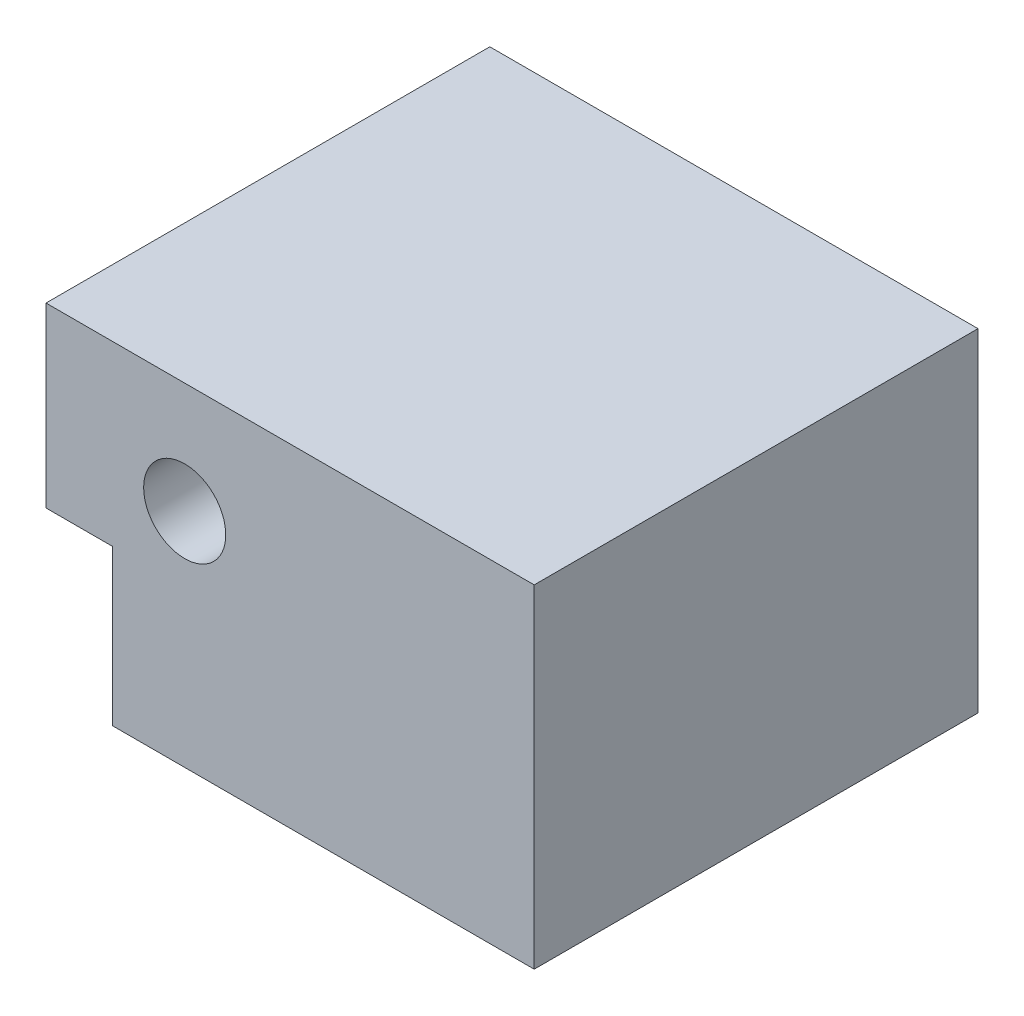
ISO-10303-21;
HEADER;
FILE_DESCRIPTION(('STEP AP214'),'2;1');
FILE_NAME('part.step','',(''),(''),'','','');
FILE_SCHEMA(('AUTOMOTIVE_DESIGN { 1 0 10303 214 1 1 1 1 }'));
ENDSEC;
DATA;
#1=APPLICATION_CONTEXT('core data for automotive mechanical design processes');
#2=APPLICATION_PROTOCOL_DEFINITION('international standard','automotive_design',2000,#1);
#3=PRODUCT_CONTEXT('',#1,'mechanical');
#4=PRODUCT('Part','Part','',(#3));
#5=PRODUCT_RELATED_PRODUCT_CATEGORY('part','',(#4));
#6=PRODUCT_DEFINITION_FORMATION('','',#4);
#7=PRODUCT_DEFINITION_CONTEXT('part definition',#1,'design');
#8=PRODUCT_DEFINITION('design','',#6,#7);
#9=PRODUCT_DEFINITION_SHAPE('','',#8);
#10=(LENGTH_UNIT() NAMED_UNIT(*) SI_UNIT(.MILLI.,.METRE.));
#11=(NAMED_UNIT(*) PLANE_ANGLE_UNIT() SI_UNIT($,.RADIAN.));
#12=(NAMED_UNIT(*) SI_UNIT($,.STERADIAN.) SOLID_ANGLE_UNIT());
#13=UNCERTAINTY_MEASURE_WITH_UNIT(LENGTH_MEASURE(1.E-05),#10,'distance_accuracy_value','');
#14=(GEOMETRIC_REPRESENTATION_CONTEXT(3) GLOBAL_UNCERTAINTY_ASSIGNED_CONTEXT((#13)) GLOBAL_UNIT_ASSIGNED_CONTEXT((#10,
#11,#12)) REPRESENTATION_CONTEXT('',''));
#15=CARTESIAN_POINT('',(0.,0.,0.));
#16=DIRECTION('',(0.,0.,1.));
#17=DIRECTION('',(1.,0.,0.));
#18=AXIS2_PLACEMENT_3D('',#15,#16,#17);
#19=CARTESIAN_POINT('',(-9.5,7.5,10.));
#20=DIRECTION('',(1.,0.,0.));
#21=DIRECTION('',(0.,0.,-1.));
#22=AXIS2_PLACEMENT_3D('',#19,#20,#21);
#23=PLANE('',#22);
#24=CARTESIAN_POINT('',(-9.5,-3.5,5.));
#25=DIRECTION('',(-1.,0.,0.));
#26=DIRECTION('',(0.,0.,1.));
#27=AXIS2_PLACEMENT_3D('',#24,#25,#26);
#28=CIRCLE('',#27,1.85);
#29=CARTESIAN_POINT('',(-9.5,-3.5,6.85));
#30=VERTEX_POINT('',#29);
#31=EDGE_CURVE('E104',#30,#30,#28,.T.);
#32=ORIENTED_EDGE('',*,*,#31,.F.);
#33=EDGE_LOOP('',(#32));
#34=FACE_BOUND('',#33,.T.);
#35=CARTESIAN_POINT('',(-9.5,-3.5,-5.));
#36=DIRECTION('',(-1.,0.,0.));
#37=DIRECTION('',(0.,0.,1.));
#38=AXIS2_PLACEMENT_3D('',#35,#36,#37);
#39=CIRCLE('',#38,1.85);
#40=CARTESIAN_POINT('',(-9.5,-3.5,-3.15));
#41=VERTEX_POINT('',#40);
#42=EDGE_CURVE('E146',#41,#41,#39,.T.);
#43=ORIENTED_EDGE('',*,*,#42,.F.);
#44=EDGE_LOOP('',(#43));
#45=FACE_BOUND('',#44,.T.);
#46=DIRECTION('',(0.,0.,1.));
#47=VECTOR('',#46,1.);
#48=CARTESIAN_POINT('',(-9.5,-0.5,-10.));
#49=LINE('',#48,#47);
#50=CARTESIAN_POINT('',(-9.5,-0.5,-10.));
#51=VERTEX_POINT('',#50);
#52=CARTESIAN_POINT('',(-9.5,-0.5,10.));
#53=VERTEX_POINT('',#52);
#54=EDGE_CURVE('E53',#51,#53,#49,.T.);
#55=ORIENTED_EDGE('',*,*,#54,.F.);
#56=DIRECTION('',(0.,-1.,0.));
#57=VECTOR('',#56,1.);
#58=CARTESIAN_POINT('',(-9.5,7.5,-10.));
#59=LINE('',#58,#57);
#60=CARTESIAN_POINT('',(-9.5,-7.5,-10.));
#61=VERTEX_POINT('',#60);
#62=EDGE_CURVE('E77',#51,#61,#59,.T.);
#63=ORIENTED_EDGE('',*,*,#62,.T.);
#64=DIRECTION('',(0.,0.,1.));
#65=VECTOR('',#64,1.);
#66=CARTESIAN_POINT('',(-9.5,-7.5,10.));
#67=LINE('',#66,#65);
#68=CARTESIAN_POINT('',(-9.5,-7.5,10.));
#69=VERTEX_POINT('',#68);
#70=EDGE_CURVE('E80',#61,#69,#67,.T.);
#71=ORIENTED_EDGE('',*,*,#70,.T.);
#72=DIRECTION('',(0.,-1.,0.));
#73=VECTOR('',#72,1.);
#74=CARTESIAN_POINT('',(-9.5,7.5,10.));
#75=LINE('',#74,#73);
#76=EDGE_CURVE('E11',#53,#69,#75,.T.);
#77=ORIENTED_EDGE('',*,*,#76,.F.);
#78=EDGE_LOOP('',(#55,#63,#71,#77));
#79=FACE_BOUND('',#78,.T.);
#80=ADVANCED_FACE('F39',(#34,#45,#79),#23,.F.);
#81=CARTESIAN_POINT('',(-9.5,7.5,10.));
#82=DIRECTION('',(0.,0.,-1.));
#83=DIRECTION('',(-1.,0.,0.));
#84=AXIS2_PLACEMENT_3D('',#81,#82,#83);
#85=PLANE('',#84);
#86=CARTESIAN_POINT('',(-6.25,2.5,10.));
#87=DIRECTION('',(0.,0.,-1.));
#88=DIRECTION('',(-1.,0.,0.));
#89=AXIS2_PLACEMENT_3D('',#86,#87,#88);
#90=CIRCLE('',#89,1.84999999999999);
#91=CARTESIAN_POINT('',(-8.1,2.5,10.));
#92=VERTEX_POINT('',#91);
#93=EDGE_CURVE('E132',#92,#92,#90,.T.);
#94=ORIENTED_EDGE('',*,*,#93,.T.);
#95=EDGE_LOOP('',(#94));
#96=FACE_BOUND('',#95,.T.);
#97=DIRECTION('',(1.,0.,0.));
#98=VECTOR('',#97,1.);
#99=CARTESIAN_POINT('',(-9.5,-7.5,10.));
#100=LINE('',#99,#98);
#101=CARTESIAN_POINT('',(9.5,-7.5,10.));
#102=VERTEX_POINT('',#101);
#103=EDGE_CURVE('E99',#69,#102,#100,.T.);
#104=ORIENTED_EDGE('',*,*,#103,.T.);
#105=DIRECTION('',(0.,-1.,0.));
#106=VECTOR('',#105,1.);
#107=CARTESIAN_POINT('',(9.5,7.5,10.));
#108=LINE('',#107,#106);
#109=CARTESIAN_POINT('',(9.5,7.5,10.));
#110=VERTEX_POINT('',#109);
#111=EDGE_CURVE('E46',#110,#102,#108,.T.);
#112=ORIENTED_EDGE('',*,*,#111,.F.);
#113=DIRECTION('',(1.,0.,0.));
#114=VECTOR('',#113,1.);
#115=CARTESIAN_POINT('',(-9.5,7.5,10.));
#116=LINE('',#115,#114);
#117=CARTESIAN_POINT('',(-12.5,7.5,10.));
#118=VERTEX_POINT('',#117);
#119=EDGE_CURVE('E94',#118,#110,#116,.T.);
#120=ORIENTED_EDGE('',*,*,#119,.F.);
#121=DIRECTION('',(0.,1.,0.));
#122=VECTOR('',#121,1.);
#123=CARTESIAN_POINT('',(-12.5,7.5,10.));
#124=LINE('',#123,#122);
#125=CARTESIAN_POINT('',(-12.5,-0.5,10.));
#126=VERTEX_POINT('',#125);
#127=EDGE_CURVE('E164',#126,#118,#124,.T.);
#128=ORIENTED_EDGE('',*,*,#127,.F.);
#129=DIRECTION('',(1.,0.,0.));
#130=VECTOR('',#129,1.);
#131=CARTESIAN_POINT('',(-12.5,-0.5,10.));
#132=LINE('',#131,#130);
#133=EDGE_CURVE('E123',#126,#53,#132,.T.);
#134=ORIENTED_EDGE('',*,*,#133,.T.);
#135=ORIENTED_EDGE('',*,*,#76,.T.);
#136=EDGE_LOOP('',(#104,#112,#120,#128,#134,#135));
#137=FACE_BOUND('',#136,.T.);
#138=ADVANCED_FACE('F116',(#96,#137),#85,.F.);
#139=CARTESIAN_POINT('',(9.5,7.5,10.));
#140=DIRECTION('',(-1.,0.,0.));
#141=DIRECTION('',(0.,0.,1.));
#142=AXIS2_PLACEMENT_3D('',#139,#140,#141);
#143=PLANE('',#142);
#144=DIRECTION('',(0.,0.,-1.));
#145=VECTOR('',#144,1.);
#146=CARTESIAN_POINT('',(9.5,-7.5,10.));
#147=LINE('',#146,#145);
#148=CARTESIAN_POINT('',(9.5,-7.5,-10.));
#149=VERTEX_POINT('',#148);
#150=EDGE_CURVE('E95',#102,#149,#147,.T.);
#151=ORIENTED_EDGE('',*,*,#150,.T.);
#152=DIRECTION('',(0.,-1.,0.));
#153=VECTOR('',#152,1.);
#154=CARTESIAN_POINT('',(9.5,7.5,-10.));
#155=LINE('',#154,#153);
#156=CARTESIAN_POINT('',(9.5,7.5,-10.));
#157=VERTEX_POINT('',#156);
#158=EDGE_CURVE('E84',#157,#149,#155,.T.);
#159=ORIENTED_EDGE('',*,*,#158,.F.);
#160=DIRECTION('',(0.,0.,-1.));
#161=VECTOR('',#160,1.);
#162=CARTESIAN_POINT('',(9.5,7.5,10.));
#163=LINE('',#162,#161);
#164=EDGE_CURVE('E62',#110,#157,#163,.T.);
#165=ORIENTED_EDGE('',*,*,#164,.F.);
#166=ORIENTED_EDGE('',*,*,#111,.T.);
#167=EDGE_LOOP('',(#151,#159,#165,#166));
#168=FACE_BOUND('',#167,.T.);
#169=ADVANCED_FACE('F113',(#168),#143,.F.);
#170=CARTESIAN_POINT('',(-9.5,7.5,-10.));
#171=DIRECTION('',(0.,0.,1.));
#172=DIRECTION('',(1.,0.,0.));
#173=AXIS2_PLACEMENT_3D('',#170,#171,#172);
#174=PLANE('',#173);
#175=CARTESIAN_POINT('',(-6.25,2.5,-10.));
#176=DIRECTION('',(0.,0.,-1.));
#177=DIRECTION('',(-1.,0.,0.));
#178=AXIS2_PLACEMENT_3D('',#175,#176,#177);
#179=CIRCLE('',#178,1.85);
#180=CARTESIAN_POINT('',(-8.1,2.5,-10.));
#181=VERTEX_POINT('',#180);
#182=EDGE_CURVE('E138',#181,#181,#179,.T.);
#183=ORIENTED_EDGE('',*,*,#182,.F.);
#184=EDGE_LOOP('',(#183));
#185=FACE_BOUND('',#184,.T.);
#186=DIRECTION('',(-1.,0.,0.));
#187=VECTOR('',#186,1.);
#188=CARTESIAN_POINT('',(-9.5,-7.5,-10.));
#189=LINE('',#188,#187);
#190=EDGE_CURVE('E89',#149,#61,#189,.T.);
#191=ORIENTED_EDGE('',*,*,#190,.T.);
#192=ORIENTED_EDGE('',*,*,#62,.F.);
#193=DIRECTION('',(1.,0.,0.));
#194=VECTOR('',#193,1.);
#195=CARTESIAN_POINT('',(-12.5,-0.5,-10.));
#196=LINE('',#195,#194);
#197=CARTESIAN_POINT('',(-12.5,-0.5,-10.));
#198=VERTEX_POINT('',#197);
#199=EDGE_CURVE('E130',#198,#51,#196,.T.);
#200=ORIENTED_EDGE('',*,*,#199,.F.);
#201=DIRECTION('',(0.,-1.,0.));
#202=VECTOR('',#201,1.);
#203=CARTESIAN_POINT('',(-12.5,7.5,-10.));
#204=LINE('',#203,#202);
#205=CARTESIAN_POINT('',(-12.5,7.5,-10.));
#206=VERTEX_POINT('',#205);
#207=EDGE_CURVE('E131',#206,#198,#204,.T.);
#208=ORIENTED_EDGE('',*,*,#207,.F.);
#209=DIRECTION('',(-1.,0.,0.));
#210=VECTOR('',#209,1.);
#211=CARTESIAN_POINT('',(-9.5,7.5,-10.));
#212=LINE('',#211,#210);
#213=EDGE_CURVE('E85',#157,#206,#212,.T.);
#214=ORIENTED_EDGE('',*,*,#213,.F.);
#215=ORIENTED_EDGE('',*,*,#158,.T.);
#216=EDGE_LOOP('',(#191,#192,#200,#208,#214,#215));
#217=FACE_BOUND('',#216,.T.);
#218=ADVANCED_FACE('F90',(#185,#217),#174,.F.);
#219=CARTESIAN_POINT('',(0.,7.5,0.));
#220=DIRECTION('',(0.,-1.,0.));
#221=DIRECTION('',(0.,0.,-1.));
#222=AXIS2_PLACEMENT_3D('',#219,#220,#221);
#223=PLANE('',#222);
#224=ORIENTED_EDGE('',*,*,#213,.T.);
#225=DIRECTION('',(0.,0.,-1.));
#226=VECTOR('',#225,1.);
#227=CARTESIAN_POINT('',(-12.5,7.5,-10.));
#228=LINE('',#227,#226);
#229=EDGE_CURVE('E142',#118,#206,#228,.T.);
#230=ORIENTED_EDGE('',*,*,#229,.F.);
#231=ORIENTED_EDGE('',*,*,#119,.T.);
#232=ORIENTED_EDGE('',*,*,#164,.T.);
#233=EDGE_LOOP('',(#224,#230,#231,#232));
#234=FACE_BOUND('',#233,.T.);
#235=ADVANCED_FACE('F157',(#234),#223,.F.);
#236=CARTESIAN_POINT('',(0.,-7.5,0.));
#237=DIRECTION('',(0.,-1.,0.));
#238=DIRECTION('',(0.,0.,-1.));
#239=AXIS2_PLACEMENT_3D('',#236,#237,#238);
#240=PLANE('',#239);
#241=ORIENTED_EDGE('',*,*,#70,.F.);
#242=ORIENTED_EDGE('',*,*,#190,.F.);
#243=ORIENTED_EDGE('',*,*,#150,.F.);
#244=ORIENTED_EDGE('',*,*,#103,.F.);
#245=EDGE_LOOP('',(#241,#242,#243,#244));
#246=FACE_BOUND('',#245,.T.);
#247=ADVANCED_FACE('F98',(#246),#240,.T.);
#248=CARTESIAN_POINT('',(2.1,-3.5,5.));
#249=DIRECTION('',(-1.,0.,0.));
#250=DIRECTION('',(0.,0.,1.));
#251=AXIS2_PLACEMENT_3D('',#248,#249,#250);
#252=CONICAL_SURFACE('',#251,1.85,1.02974425867665);
#253=CARTESIAN_POINT('',(3.21159214520099,-3.5,5.));
#254=VERTEX_POINT('',#253);
#255=VERTEX_LOOP('',#254);
#256=FACE_BOUND('',#255,.T.);
#257=CARTESIAN_POINT('',(2.1,-3.5,5.));
#258=DIRECTION('',(-1.,0.,0.));
#259=DIRECTION('',(0.,0.,1.));
#260=AXIS2_PLACEMENT_3D('',#257,#258,#259);
#261=CIRCLE('',#260,1.85);
#262=CARTESIAN_POINT('',(2.1,-3.5,6.85));
#263=VERTEX_POINT('',#262);
#264=EDGE_CURVE('E100',#263,#263,#261,.T.);
#265=ORIENTED_EDGE('',*,*,#264,.T.);
#266=EDGE_LOOP('',(#265));
#267=FACE_BOUND('',#266,.T.);
#268=ADVANCED_FACE('F172',(#256,#267),#252,.F.);
#269=CARTESIAN_POINT('',(-9.5,-3.5,5.));
#270=DIRECTION('',(-1.,0.,0.));
#271=DIRECTION('',(0.,0.,1.));
#272=AXIS2_PLACEMENT_3D('',#269,#270,#271);
#273=CYLINDRICAL_SURFACE('',#272,1.85);
#274=ORIENTED_EDGE('',*,*,#264,.F.);
#275=EDGE_LOOP('',(#274));
#276=FACE_BOUND('',#275,.T.);
#277=ORIENTED_EDGE('',*,*,#31,.T.);
#278=EDGE_LOOP('',(#277));
#279=FACE_BOUND('',#278,.T.);
#280=ADVANCED_FACE('F175',(#276,#279),#273,.F.);
#281=CARTESIAN_POINT('',(2.1,-3.5,-5.));
#282=DIRECTION('',(-1.,0.,0.));
#283=DIRECTION('',(0.,0.,1.));
#284=AXIS2_PLACEMENT_3D('',#281,#282,#283);
#285=CONICAL_SURFACE('',#284,1.85,1.02974425867665);
#286=CARTESIAN_POINT('',(3.21159214520099,-3.5,-5.));
#287=VERTEX_POINT('',#286);
#288=VERTEX_LOOP('',#287);
#289=FACE_BOUND('',#288,.T.);
#290=CARTESIAN_POINT('',(2.1,-3.5,-5.));
#291=DIRECTION('',(-1.,0.,0.));
#292=DIRECTION('',(0.,0.,1.));
#293=AXIS2_PLACEMENT_3D('',#290,#291,#292);
#294=CIRCLE('',#293,1.85);
#295=CARTESIAN_POINT('',(2.1,-3.5,-3.15));
#296=VERTEX_POINT('',#295);
#297=EDGE_CURVE('E149',#296,#296,#294,.T.);
#298=ORIENTED_EDGE('',*,*,#297,.T.);
#299=EDGE_LOOP('',(#298));
#300=FACE_BOUND('',#299,.T.);
#301=ADVANCED_FACE('F181',(#289,#300),#285,.F.);
#302=CARTESIAN_POINT('',(-9.5,-3.5,-5.));
#303=DIRECTION('',(-1.,0.,0.));
#304=DIRECTION('',(0.,0.,1.));
#305=AXIS2_PLACEMENT_3D('',#302,#303,#304);
#306=CYLINDRICAL_SURFACE('',#305,1.85);
#307=ORIENTED_EDGE('',*,*,#297,.F.);
#308=EDGE_LOOP('',(#307));
#309=FACE_BOUND('',#308,.T.);
#310=ORIENTED_EDGE('',*,*,#42,.T.);
#311=EDGE_LOOP('',(#310));
#312=FACE_BOUND('',#311,.T.);
#313=ADVANCED_FACE('F189',(#309,#312),#306,.F.);
#314=CARTESIAN_POINT('',(-12.5,-0.5,-10.));
#315=DIRECTION('',(0.,1.,0.));
#316=DIRECTION('',(0.,0.,1.));
#317=AXIS2_PLACEMENT_3D('',#314,#315,#316);
#318=PLANE('',#317);
#319=ORIENTED_EDGE('',*,*,#54,.T.);
#320=ORIENTED_EDGE('',*,*,#133,.F.);
#321=DIRECTION('',(0.,0.,1.));
#322=VECTOR('',#321,1.);
#323=CARTESIAN_POINT('',(-12.5,-0.5,-10.));
#324=LINE('',#323,#322);
#325=EDGE_CURVE('E135',#198,#126,#324,.T.);
#326=ORIENTED_EDGE('',*,*,#325,.F.);
#327=ORIENTED_EDGE('',*,*,#199,.T.);
#328=EDGE_LOOP('',(#319,#320,#326,#327));
#329=FACE_BOUND('',#328,.T.);
#330=ADVANCED_FACE('F127',(#329),#318,.F.);
#331=CARTESIAN_POINT('',(-12.5,0.,0.));
#332=DIRECTION('',(-1.,0.,0.));
#333=DIRECTION('',(0.,0.,1.));
#334=AXIS2_PLACEMENT_3D('',#331,#332,#333);
#335=PLANE('',#334);
#336=ORIENTED_EDGE('',*,*,#207,.T.);
#337=ORIENTED_EDGE('',*,*,#325,.T.);
#338=ORIENTED_EDGE('',*,*,#127,.T.);
#339=ORIENTED_EDGE('',*,*,#229,.T.);
#340=EDGE_LOOP('',(#336,#337,#338,#339));
#341=FACE_BOUND('',#340,.T.);
#342=ADVANCED_FACE('F162',(#341),#335,.T.);
#343=CARTESIAN_POINT('',(-6.25,2.5,-10.));
#344=DIRECTION('',(0.,0.,-1.));
#345=DIRECTION('',(-1.,0.,0.));
#346=AXIS2_PLACEMENT_3D('',#343,#344,#345);
#347=CYLINDRICAL_SURFACE('',#346,1.85);
#348=ORIENTED_EDGE('',*,*,#93,.F.);
#349=EDGE_LOOP('',(#348));
#350=FACE_BOUND('',#349,.T.);
#351=ORIENTED_EDGE('',*,*,#182,.T.);
#352=EDGE_LOOP('',(#351));
#353=FACE_BOUND('',#352,.T.);
#354=ADVANCED_FACE('F217',(#350,#353),#347,.F.);
#355=CLOSED_SHELL('',(#80,#138,#169,#218,#235,#247,#268,#280,#301,#313,#330,#342,#354));
#356=MANIFOLD_SOLID_BREP('B2',#355);
#357=ADVANCED_BREP_SHAPE_REPRESENTATION('',(#18,#356),#14);
#358=SHAPE_DEFINITION_REPRESENTATION(#9,#357);
ENDSEC;
END-ISO-10303-21;
